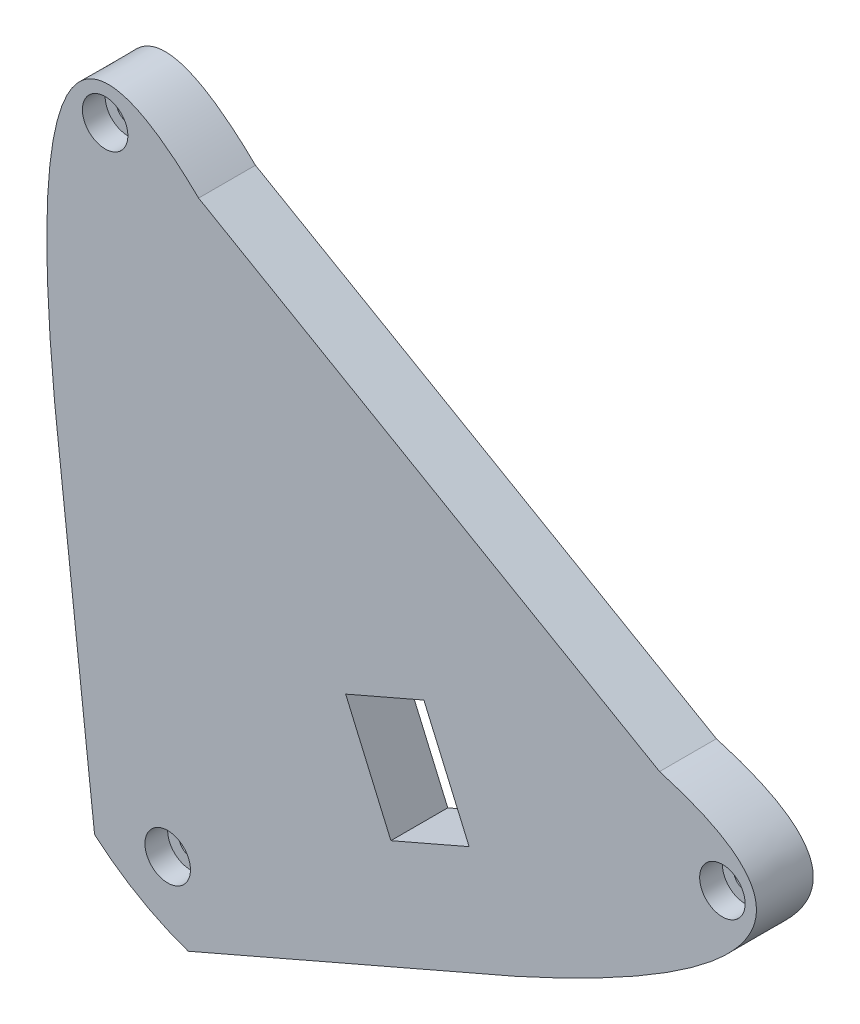
ISO-10303-21;
HEADER;
FILE_DESCRIPTION(('STEP AP214'),'2;1');
FILE_NAME('part.step','',(''),(''),'','','');
FILE_SCHEMA(('AUTOMOTIVE_DESIGN { 1 0 10303 214 1 1 1 1 }'));
ENDSEC;
DATA;
#1=APPLICATION_CONTEXT('core data for automotive mechanical design processes');
#2=APPLICATION_PROTOCOL_DEFINITION('international standard','automotive_design',2000,#1);
#3=PRODUCT_CONTEXT('',#1,'mechanical');
#4=PRODUCT('Part','Part','',(#3));
#5=PRODUCT_RELATED_PRODUCT_CATEGORY('part','',(#4));
#6=PRODUCT_DEFINITION_FORMATION('','',#4);
#7=PRODUCT_DEFINITION_CONTEXT('part definition',#1,'design');
#8=PRODUCT_DEFINITION('design','',#6,#7);
#9=PRODUCT_DEFINITION_SHAPE('','',#8);
#10=(LENGTH_UNIT() NAMED_UNIT(*) SI_UNIT(.MILLI.,.METRE.));
#11=(NAMED_UNIT(*) PLANE_ANGLE_UNIT() SI_UNIT($,.RADIAN.));
#12=(NAMED_UNIT(*) SI_UNIT($,.STERADIAN.) SOLID_ANGLE_UNIT());
#13=UNCERTAINTY_MEASURE_WITH_UNIT(LENGTH_MEASURE(1.E-05),#10,'distance_accuracy_value','');
#14=(GEOMETRIC_REPRESENTATION_CONTEXT(3) GLOBAL_UNCERTAINTY_ASSIGNED_CONTEXT((#13)) GLOBAL_UNIT_ASSIGNED_CONTEXT((#10,
#11,#12)) REPRESENTATION_CONTEXT('',''));
#15=CARTESIAN_POINT('',(0.,0.,0.));
#16=DIRECTION('',(0.,0.,1.));
#17=DIRECTION('',(1.,0.,0.));
#18=AXIS2_PLACEMENT_3D('',#15,#16,#17);
#19=CARTESIAN_POINT('',(-19.9999999999671,-34.6410161513855,-10.000025));
#20=DIRECTION('',(0.,0.,1.));
#21=DIRECTION('',(1.,0.,0.));
#22=AXIS2_PLACEMENT_3D('',#19,#20,#21);
#23=CYLINDRICAL_SURFACE('',#22,1.99999999999974);
#24=CARTESIAN_POINT('',(-19.9999999999671,-34.6410161513855,-10.));
#25=DIRECTION('',(0.,0.,1.));
#26=DIRECTION('',(1.,0.,0.));
#27=AXIS2_PLACEMENT_3D('',#24,#25,#26);
#28=CIRCLE('',#27,1.99999999999974);
#29=CARTESIAN_POINT('',(-17.9999999999674,-34.6410161513855,-10.));
#30=VERTEX_POINT('',#29);
#31=EDGE_CURVE('E360',#30,#30,#28,.T.);
#32=ORIENTED_EDGE('',*,*,#31,.F.);
#33=EDGE_LOOP('',(#32));
#34=FACE_BOUND('',#33,.T.);
#35=CARTESIAN_POINT('',(-19.9999999999671,-34.6410161513855,-4.));
#36=DIRECTION('',(0.,0.,1.));
#37=DIRECTION('',(1.,0.,0.));
#38=AXIS2_PLACEMENT_3D('',#35,#36,#37);
#39=CIRCLE('',#38,1.99999999999974);
#40=CARTESIAN_POINT('',(-17.9999999999674,-34.6410161513855,-4.));
#41=VERTEX_POINT('',#40);
#42=EDGE_CURVE('E43',#41,#41,#39,.F.);
#43=ORIENTED_EDGE('',*,*,#42,.F.);
#44=EDGE_LOOP('',(#43));
#45=FACE_BOUND('',#44,.T.);
#46=ADVANCED_FACE('F39',(#34,#45),#23,.F.);
#47=CARTESIAN_POINT('',(-31.0025184223115,71.6681652679213,10.));
#48=DIRECTION('',(0.,0.,-1.));
#49=DIRECTION('',(-1.,0.,0.));
#50=AXIS2_PLACEMENT_3D('',#47,#48,#49);
#51=CYLINDRICAL_SURFACE('',#50,1.99999999999708);
#52=CARTESIAN_POINT('',(-31.0025184223115,71.6681652679213,-10.));
#53=DIRECTION('',(0.,0.,1.));
#54=DIRECTION('',(1.,0.,0.));
#55=AXIS2_PLACEMENT_3D('',#52,#53,#54);
#56=CIRCLE('',#55,1.99999999999706);
#57=CARTESIAN_POINT('',(-29.0025184223144,71.6681652679213,-10.));
#58=VERTEX_POINT('',#57);
#59=EDGE_CURVE('E350',#58,#58,#56,.T.);
#60=ORIENTED_EDGE('',*,*,#59,.F.);
#61=EDGE_LOOP('',(#60));
#62=FACE_BOUND('',#61,.T.);
#63=CARTESIAN_POINT('',(-31.0025184223115,71.6681652679213,-4.));
#64=DIRECTION('',(0.,0.,1.));
#65=DIRECTION('',(1.,0.,0.));
#66=AXIS2_PLACEMENT_3D('',#63,#64,#65);
#67=CIRCLE('',#66,1.99999999999708);
#68=CARTESIAN_POINT('',(-29.0025184223144,71.6681652679213,-4.));
#69=VERTEX_POINT('',#68);
#70=EDGE_CURVE('E163',#69,#69,#67,.F.);
#71=ORIENTED_EDGE('',*,*,#70,.F.);
#72=EDGE_LOOP('',(#71));
#73=FACE_BOUND('',#72,.T.);
#74=ADVANCED_FACE('F258',(#62,#73),#51,.F.);
#75=CARTESIAN_POINT('',(77.5685544225147,8.98307716251005,10.));
#76=DIRECTION('',(0.,0.,-1.));
#77=DIRECTION('',(-1.,0.,0.));
#78=AXIS2_PLACEMENT_3D('',#75,#76,#77);
#79=CYLINDRICAL_SURFACE('',#78,1.99999999997602);
#80=CARTESIAN_POINT('',(77.5685544225147,8.98307716251005,-10.));
#81=DIRECTION('',(0.,0.,1.));
#82=DIRECTION('',(1.,0.,0.));
#83=AXIS2_PLACEMENT_3D('',#80,#81,#82);
#84=CIRCLE('',#83,1.9999999999738);
#85=CARTESIAN_POINT('',(79.5685544224885,8.98307716251005,-10.));
#86=VERTEX_POINT('',#85);
#87=EDGE_CURVE('E236',#86,#86,#84,.T.);
#88=ORIENTED_EDGE('',*,*,#87,.F.);
#89=EDGE_LOOP('',(#88));
#90=FACE_BOUND('',#89,.T.);
#91=CARTESIAN_POINT('',(77.5685544225147,8.98307716251005,-4.));
#92=DIRECTION('',(0.,0.,1.));
#93=DIRECTION('',(1.,0.,0.));
#94=AXIS2_PLACEMENT_3D('',#91,#92,#93);
#95=CIRCLE('',#94,1.99999999997602);
#96=CARTESIAN_POINT('',(79.5685544224907,8.98307716251005,-4.));
#97=VERTEX_POINT('',#96);
#98=EDGE_CURVE('E170',#97,#97,#95,.F.);
#99=ORIENTED_EDGE('',*,*,#98,.F.);
#100=EDGE_LOOP('',(#99));
#101=FACE_BOUND('',#100,.T.);
#102=ADVANCED_FACE('F260',(#90,#101),#79,.F.);
#103=CARTESIAN_POINT('',(-32.8605571852556,-37.6853258109114,-10.));
#104=DIRECTION('',(0.993699989141695,0.112072885123007,0.));
#105=DIRECTION('',(-0.112072885123007,0.993699989141695,0.));
#106=AXIS2_PLACEMENT_3D('',#103,#104,#105);
#107=PLANE('',#106);
#108=DIRECTION('',(-0.112072885123007,0.993699989141695,0.));
#109=VECTOR('',#108,1.);
#110=CARTESIAN_POINT('',(-32.8605571852556,-37.6853258109114,0.));
#111=LINE('',#110,#109);
#112=CARTESIAN_POINT('',(-32.8605571852556,-37.6853258109114,0.));
#113=VERTEX_POINT('',#112);
#114=CARTESIAN_POINT('',(-39.8797413229761,24.5506306720594,0.));
#115=VERTEX_POINT('',#114);
#116=EDGE_CURVE('E313',#113,#115,#111,.T.);
#117=ORIENTED_EDGE('',*,*,#116,.T.);
#118=DIRECTION('',(0.,0.,1.));
#119=VECTOR('',#118,1.);
#120=CARTESIAN_POINT('',(-39.8797413229761,24.5506306720594,-10.));
#121=LINE('',#120,#119);
#122=CARTESIAN_POINT('',(-39.8797413229761,24.5506306720594,-10.));
#123=VERTEX_POINT('',#122);
#124=EDGE_CURVE('E317',#123,#115,#121,.T.);
#125=ORIENTED_EDGE('',*,*,#124,.F.);
#126=DIRECTION('',(-0.112072885123007,0.993699989141695,0.));
#127=VECTOR('',#126,1.);
#128=CARTESIAN_POINT('',(-32.8605571852556,-37.6853258109114,-10.));
#129=LINE('',#128,#127);
#130=CARTESIAN_POINT('',(-32.8605571852556,-37.6853258109114,-10.));
#131=VERTEX_POINT('',#130);
#132=EDGE_CURVE('E304',#131,#123,#129,.T.);
#133=ORIENTED_EDGE('',*,*,#132,.F.);
#134=DIRECTION('',(0.,0.,1.));
#135=VECTOR('',#134,1.);
#136=CARTESIAN_POINT('',(-32.8605571852556,-37.6853258109114,-10.));
#137=LINE('',#136,#135);
#138=EDGE_CURVE('E320',#131,#113,#137,.T.);
#139=ORIENTED_EDGE('',*,*,#138,.T.);
#140=EDGE_LOOP('',(#117,#125,#133,#139));
#141=FACE_BOUND('',#140,.T.);
#142=ADVANCED_FACE('F263',(#141),#107,.F.);
#143=CARTESIAN_POINT('',(66.5193094190735,21.5904547621005,-10.));
#144=DIRECTION('',(-0.500008271954438,-0.866020627916643,0.));
#145=DIRECTION('',(0.866020627916643,-0.500008271954438,0.));
#146=AXIS2_PLACEMENT_3D('',#143,#144,#145);
#147=PLANE('',#146);
#148=DIRECTION('',(0.866020627916643,-0.500008271954438,0.));
#149=VECTOR('',#148,1.);
#150=CARTESIAN_POINT('',(66.5193094190735,21.5904547621005,0.));
#151=LINE('',#150,#149);
#152=CARTESIAN_POINT('',(-14.5613252713761,68.4034136382289,0.));
#153=VERTEX_POINT('',#152);
#154=CARTESIAN_POINT('',(66.5193094190686,21.590454762098,0.));
#155=VERTEX_POINT('',#154);
#156=EDGE_CURVE('E244',#153,#155,#151,.T.);
#157=ORIENTED_EDGE('',*,*,#156,.T.);
#158=DIRECTION('',(0.,0.,1.));
#159=VECTOR('',#158,1.);
#160=CARTESIAN_POINT('',(66.5193094190735,21.5904547621005,-10.));
#161=LINE('',#160,#159);
#162=CARTESIAN_POINT('',(66.5193094190735,21.5904547621005,-10.));
#163=VERTEX_POINT('',#162);
#164=EDGE_CURVE('E309',#163,#155,#161,.T.);
#165=ORIENTED_EDGE('',*,*,#164,.F.);
#166=DIRECTION('',(0.866020627916643,-0.500008271954438,0.));
#167=VECTOR('',#166,1.);
#168=CARTESIAN_POINT('',(66.5193094190735,21.5904547621005,-10.));
#169=LINE('',#168,#167);
#170=CARTESIAN_POINT('',(-14.5613252715264,68.4034136379685,-10.));
#171=VERTEX_POINT('',#170);
#172=EDGE_CURVE('E303',#171,#163,#169,.T.);
#173=ORIENTED_EDGE('',*,*,#172,.F.);
#174=DIRECTION('',(0.,0.,1.));
#175=VECTOR('',#174,1.);
#176=CARTESIAN_POINT('',(-14.5613252715264,68.4034136379685,-10.));
#177=LINE('',#176,#175);
#178=EDGE_CURVE('E321',#171,#153,#177,.T.);
#179=ORIENTED_EDGE('',*,*,#178,.T.);
#180=EDGE_LOOP('',(#157,#165,#173,#179));
#181=FACE_BOUND('',#180,.T.);
#182=ADVANCED_FACE('F269',(#181),#147,.F.);
#183=CARTESIAN_POINT('',(347781.240949664,-937493.25120147,-10.));
#184=CARTESIAN_POINT('',(-351266.927481728,936365.067628403,-10.));
#185=CARTESIAN_POINT('',(354620.84295731,-934927.479350772,-10.));
#186=B_SPLINE_CURVE_WITH_KNOTS('',2,(#183,#184,#185),.UNSPECIFIED.,.F.,.F.,(3,3),(0.,1.),.UNSPECIFIED.);
#187=DIRECTION('',(0.,0.,1.));
#188=VECTOR('',#187,1.);
#189=SURFACE_OF_LINEAR_EXTRUSION('',#186,#188);
#190=CARTESIAN_POINT('',(-39.8797413229761,24.5506306720594,0.));
#191=CARTESIAN_POINT('',(-49.4507614021182,121.356698814482,0.));
#192=CARTESIAN_POINT('',(7.01020764564998,42.1406762638789,0.));
#193=B_SPLINE_CURVE_WITH_KNOTS('',2,(#190,#191,#192),.UNSPECIFIED.,.F.,.F.,(3,3),(0.,1.),.UNSPECIFIED.);
#194=EDGE_CURVE('E11',#115,#153,#193,.T.);
#195=ORIENTED_EDGE('',*,*,#194,.T.);
#196=ORIENTED_EDGE('',*,*,#178,.F.);
#197=EDGE_CURVE('E297',#123,#171,#186,.T.);
#198=ORIENTED_EDGE('',*,*,#197,.F.);
#199=ORIENTED_EDGE('',*,*,#124,.T.);
#200=EDGE_LOOP('',(#195,#196,#198,#199));
#201=FACE_BOUND('',#200,.T.);
#202=ADVANCED_FACE('F287',(#201),#189,.F.);
#203=CARTESIAN_POINT('',(83.4602158814448,10.145005483821,-10.));
#204=DIRECTION('',(0.,0.,1.));
#205=DIRECTION('',(1.,0.,0.));
#206=AXIS2_PLACEMENT_3D('',#203,#204,#205);
#207=PLANE('',#206);
#208=DIRECTION('',(0.397857064454927,-0.917447413350383,0.));
#209=VECTOR('',#208,1.);
#210=CARTESIAN_POINT('',(25.0659782440868,11.7511390990852,-10.));
#211=LINE('',#210,#209);
#212=CARTESIAN_POINT('',(25.0659782440868,11.7511390990852,-10.));
#213=VERTEX_POINT('',#212);
#214=CARTESIAN_POINT('',(33.0231195331853,-6.59780916792243,-10.));
#215=VERTEX_POINT('',#214);
#216=EDGE_CURVE('E141',#213,#215,#211,.T.);
#217=ORIENTED_EDGE('',*,*,#216,.F.);
#218=DIRECTION('',(0.917447413350383,0.397857064454927,0.));
#219=VECTOR('',#218,1.);
#220=CARTESIAN_POINT('',(11.3042670438311,5.78328313226132,-10.));
#221=LINE('',#220,#219);
#222=CARTESIAN_POINT('',(11.3042670438311,5.78328313226132,-10.));
#223=VERTEX_POINT('',#222);
#224=EDGE_CURVE('E134',#223,#213,#221,.T.);
#225=ORIENTED_EDGE('',*,*,#224,.F.);
#226=DIRECTION('',(-0.397857064454927,0.917447413350383,0.));
#227=VECTOR('',#226,1.);
#228=CARTESIAN_POINT('',(11.3042670438311,5.78328313226132,-10.));
#229=LINE('',#228,#227);
#230=CARTESIAN_POINT('',(19.2614083329296,-12.5656651347463,-10.));
#231=VERTEX_POINT('',#230);
#232=EDGE_CURVE('E145',#231,#223,#229,.T.);
#233=ORIENTED_EDGE('',*,*,#232,.F.);
#234=DIRECTION('',(-0.917447413350382,-0.397857064454927,0.));
#235=VECTOR('',#234,1.);
#236=CARTESIAN_POINT('',(19.2614083329296,-12.5656651347463,-10.));
#237=LINE('',#236,#235);
#238=EDGE_CURVE('E56',#215,#231,#237,.T.);
#239=ORIENTED_EDGE('',*,*,#238,.F.);
#240=EDGE_LOOP('',(#217,#225,#233,#239));
#241=FACE_BOUND('',#240,.T.);
#242=CARTESIAN_POINT('',(15.8487739846796,11.5689708061704,-10.));
#243=DIRECTION('',(0.,0.,-1.));
#244=DIRECTION('',(-1.,0.,0.));
#245=AXIS2_PLACEMENT_3D('',#242,#243,#244);
#246=CIRCLE('',#245,1.25);
#247=CARTESIAN_POINT('',(14.5987739846796,11.5689708061704,-10.));
#248=VERTEX_POINT('',#247);
#249=EDGE_CURVE('E178',#248,#248,#246,.T.);
#250=ORIENTED_EDGE('',*,*,#249,.F.);
#251=EDGE_LOOP('',(#250));
#252=FACE_BOUND('',#251,.T.);
#253=CARTESIAN_POINT('',(23.1883532914827,14.7518273218098,-10.));
#254=DIRECTION('',(0.,0.,-1.));
#255=DIRECTION('',(-1.,0.,0.));
#256=AXIS2_PLACEMENT_3D('',#253,#254,#255);
#257=CIRCLE('',#256,1.25);
#258=CARTESIAN_POINT('',(21.9383532914827,14.7518273218098,-10.));
#259=VERTEX_POINT('',#258);
#260=EDGE_CURVE('E177',#259,#259,#257,.T.);
#261=ORIENTED_EDGE('',*,*,#260,.F.);
#262=EDGE_LOOP('',(#261));
#263=FACE_BOUND('',#262,.T.);
#264=CARTESIAN_POINT('',(30.5279325982857,17.9346838374492,-10.));
#265=DIRECTION('',(0.,0.,-1.));
#266=DIRECTION('',(-1.,0.,0.));
#267=AXIS2_PLACEMENT_3D('',#264,#265,#266);
#268=CIRCLE('',#267,1.25000000000001);
#269=CARTESIAN_POINT('',(29.2779325982857,17.9346838374492,-10.));
#270=VERTEX_POINT('',#269);
#271=EDGE_CURVE('E184',#270,#270,#268,.T.);
#272=ORIENTED_EDGE('',*,*,#271,.F.);
#273=EDGE_LOOP('',(#272));
#274=FACE_BOUND('',#273,.T.);
#275=CARTESIAN_POINT('',(37.5327453728774,14.9774726524105,-10.));
#276=DIRECTION('',(0.,0.,-1.));
#277=DIRECTION('',(-1.,0.,0.));
#278=AXIS2_PLACEMENT_3D('',#275,#276,#277);
#279=CIRCLE('',#278,1.25);
#280=CARTESIAN_POINT('',(36.2827453728774,14.9774726524105,-10.));
#281=VERTEX_POINT('',#280);
#282=EDGE_CURVE('E190',#281,#281,#279,.T.);
#283=ORIENTED_EDGE('',*,*,#282,.F.);
#284=EDGE_LOOP('',(#283));
#285=FACE_BOUND('',#284,.T.);
#286=CARTESIAN_POINT('',(43.8984584041562,0.298314038804333,-10.));
#287=DIRECTION('',(0.,0.,-1.));
#288=DIRECTION('',(-1.,0.,0.));
#289=AXIS2_PLACEMENT_3D('',#286,#287,#288);
#290=CIRCLE('',#289,1.25);
#291=CARTESIAN_POINT('',(42.6484584041562,0.298314038804333,-10.));
#292=VERTEX_POINT('',#291);
#293=EDGE_CURVE('E196',#292,#292,#290,.T.);
#294=ORIENTED_EDGE('',*,*,#293,.F.);
#295=EDGE_LOOP('',(#294));
#296=FACE_BOUND('',#295,.T.);
#297=CARTESIAN_POINT('',(41.2700733385688,-6.83639632301115,-10.));
#298=DIRECTION('',(0.,0.,-1.));
#299=DIRECTION('',(-1.,0.,0.));
#300=AXIS2_PLACEMENT_3D('',#297,#298,#299);
#301=CIRCLE('',#300,1.25);
#302=CARTESIAN_POINT('',(40.0200733385688,-6.83639632301115,-10.));
#303=VERTEX_POINT('',#302);
#304=EDGE_CURVE('E202',#303,#303,#301,.T.);
#305=ORIENTED_EDGE('',*,*,#304,.F.);
#306=EDGE_LOOP('',(#305));
#307=FACE_BOUND('',#306,.T.);
#308=CARTESIAN_POINT('',(33.9304940317657,-10.0192528386506,-10.));
#309=DIRECTION('',(0.,0.,-1.));
#310=DIRECTION('',(-1.,0.,0.));
#311=AXIS2_PLACEMENT_3D('',#308,#309,#310);
#312=CIRCLE('',#311,1.25);
#313=CARTESIAN_POINT('',(32.6804940317657,-10.0192528386506,-10.));
#314=VERTEX_POINT('',#313);
#315=EDGE_CURVE('E208',#314,#314,#312,.T.);
#316=ORIENTED_EDGE('',*,*,#315,.F.);
#317=EDGE_LOOP('',(#316));
#318=FACE_BOUND('',#317,.T.);
#319=CARTESIAN_POINT('',(26.5909147249626,-13.20210935429,-10.));
#320=DIRECTION('',(0.,0.,-1.));
#321=DIRECTION('',(-1.,0.,0.));
#322=AXIS2_PLACEMENT_3D('',#319,#320,#321);
#323=CIRCLE('',#322,1.25);
#324=CARTESIAN_POINT('',(25.3409147249626,-13.20210935429,-10.));
#325=VERTEX_POINT('',#324);
#326=EDGE_CURVE('E214',#325,#325,#323,.T.);
#327=ORIENTED_EDGE('',*,*,#326,.F.);
#328=EDGE_LOOP('',(#327));
#329=FACE_BOUND('',#328,.T.);
#330=CARTESIAN_POINT('',(19.2513354181596,-16.3849658699294,-10.));
#331=DIRECTION('',(0.,0.,-1.));
#332=DIRECTION('',(-1.,0.,0.));
#333=AXIS2_PLACEMENT_3D('',#330,#331,#332);
#334=CIRCLE('',#333,1.25);
#335=CARTESIAN_POINT('',(18.0013354181596,-16.3849658699294,-10.));
#336=VERTEX_POINT('',#335);
#337=EDGE_CURVE('E220',#336,#336,#334,.T.);
#338=ORIENTED_EDGE('',*,*,#337,.F.);
#339=EDGE_LOOP('',(#338));
#340=FACE_BOUND('',#339,.T.);
#341=CARTESIAN_POINT('',(8.50919467787656,8.38611429053095,-10.));
#342=DIRECTION('',(0.,0.,-1.));
#343=DIRECTION('',(-1.,0.,0.));
#344=AXIS2_PLACEMENT_3D('',#341,#342,#343);
#345=CIRCLE('',#344,1.25);
#346=CARTESIAN_POINT('',(7.25919467787656,8.38611429053095,-10.));
#347=VERTEX_POINT('',#346);
#348=EDGE_CURVE('E226',#347,#347,#345,.T.);
#349=ORIENTED_EDGE('',*,*,#348,.F.);
#350=EDGE_LOOP('',(#349));
#351=FACE_BOUND('',#350,.T.);
#352=ORIENTED_EDGE('',*,*,#87,.T.);
#353=EDGE_LOOP('',(#352));
#354=FACE_BOUND('',#353,.T.);
#355=ORIENTED_EDGE('',*,*,#31,.T.);
#356=EDGE_LOOP('',(#355));
#357=FACE_BOUND('',#356,.T.);
#358=ORIENTED_EDGE('',*,*,#59,.T.);
#359=EDGE_LOOP('',(#358));
#360=FACE_BOUND('',#359,.T.);
#361=CARTESIAN_POINT('',(-986984.720288562,-160332.448870074,-10.));
#362=CARTESIAN_POINT('',(986552.837890996,163955.766811227,-10.));
#363=CARTESIAN_POINT('',(-985787.114629905,-167538.504730445,-10.));
#364=B_SPLINE_CURVE_WITH_KNOTS('',2,(#361,#362,#363),.UNSPECIFIED.,.F.,.F.,(3,3),(0.,1.),.UNSPECIFIED.);
#365=CARTESIAN_POINT('',(41.2013405024208,-22.2615537460207,-10.));
#366=VERTEX_POINT('',#365);
#367=EDGE_CURVE('E237',#163,#366,#364,.T.);
#368=ORIENTED_EDGE('',*,*,#367,.T.);
#369=DIRECTION('',(-0.917447413350383,-0.397857064454926,0.));
#370=VECTOR('',#369,1.);
#371=CARTESIAN_POINT('',(41.2013405024208,-22.2615537460207,-10.));
#372=LINE('',#371,#370);
#373=CARTESIAN_POINT('',(-16.3912070082697,-47.2369382243605,-10.));
#374=VERTEX_POINT('',#373);
#375=EDGE_CURVE('E243',#366,#374,#372,.T.);
#376=ORIENTED_EDGE('',*,*,#375,.T.);
#377=CARTESIAN_POINT('',(0.,0.,-10.));
#378=DIRECTION('',(0.,0.,-1.));
#379=DIRECTION('',(-1.,0.,0.));
#380=AXIS2_PLACEMENT_3D('',#377,#378,#379);
#381=CIRCLE('',#380,50.);
#382=EDGE_CURVE('E487',#374,#131,#381,.T.);
#383=ORIENTED_EDGE('',*,*,#382,.T.);
#384=ORIENTED_EDGE('',*,*,#132,.T.);
#385=ORIENTED_EDGE('',*,*,#197,.T.);
#386=ORIENTED_EDGE('',*,*,#172,.T.);
#387=EDGE_LOOP('',(#368,#376,#383,#384,#385,#386));
#388=FACE_BOUND('',#387,.T.);
#389=ADVANCED_FACE('F284',(#241,#252,#263,#274,#285,#296,#307,#318,#329,#340,#351,#354,#357,
#360,#388),#207,.F.);
#390=CARTESIAN_POINT('',(0.,0.,10.));
#391=DIRECTION('',(0.,0.,-1.));
#392=DIRECTION('',(-1.,0.,0.));
#393=AXIS2_PLACEMENT_3D('',#390,#391,#392);
#394=CYLINDRICAL_SURFACE('',#393,50.);
#395=CARTESIAN_POINT('',(0.,0.,0.));
#396=DIRECTION('',(0.,0.,1.));
#397=DIRECTION('',(1.,0.,0.));
#398=AXIS2_PLACEMENT_3D('',#395,#396,#397);
#399=CIRCLE('',#398,50.);
#400=CARTESIAN_POINT('',(-16.3912070082697,-47.2369382243605,0.));
#401=VERTEX_POINT('',#400);
#402=EDGE_CURVE('E232',#113,#401,#399,.T.);
#403=ORIENTED_EDGE('',*,*,#402,.F.);
#404=ORIENTED_EDGE('',*,*,#138,.F.);
#405=ORIENTED_EDGE('',*,*,#382,.F.);
#406=DIRECTION('',(0.,0.,1.));
#407=VECTOR('',#406,1.);
#408=CARTESIAN_POINT('',(-16.3912070082697,-47.2369382243605,-10.));
#409=LINE('',#408,#407);
#410=EDGE_CURVE('E324',#374,#401,#409,.T.);
#411=ORIENTED_EDGE('',*,*,#410,.T.);
#412=EDGE_LOOP('',(#403,#404,#405,#411));
#413=FACE_BOUND('',#412,.T.);
#414=ADVANCED_FACE('F41',(#413),#394,.T.);
#415=CARTESIAN_POINT('',(83.4602158814448,10.145005483821,0.));
#416=DIRECTION('',(0.,0.,1.));
#417=DIRECTION('',(1.,0.,0.));
#418=AXIS2_PLACEMENT_3D('',#415,#416,#417);
#419=PLANE('',#418);
#420=DIRECTION('',(0.917447413350383,0.397857064454927,0.));
#421=VECTOR('',#420,1.);
#422=CARTESIAN_POINT('',(11.3042670438311,5.78328313226132,0.));
#423=LINE('',#422,#421);
#424=CARTESIAN_POINT('',(11.3042670438311,5.78328313226132,0.));
#425=VERTEX_POINT('',#424);
#426=CARTESIAN_POINT('',(25.0659782440868,11.7511390990852,0.));
#427=VERTEX_POINT('',#426);
#428=EDGE_CURVE('E131',#425,#427,#423,.T.);
#429=ORIENTED_EDGE('',*,*,#428,.T.);
#430=DIRECTION('',(0.397857064454927,-0.917447413350383,0.));
#431=VECTOR('',#430,1.);
#432=CARTESIAN_POINT('',(25.0659782440868,11.7511390990852,0.));
#433=LINE('',#432,#431);
#434=CARTESIAN_POINT('',(33.0231195331853,-6.59780916792243,0.));
#435=VERTEX_POINT('',#434);
#436=EDGE_CURVE('E118',#427,#435,#433,.T.);
#437=ORIENTED_EDGE('',*,*,#436,.T.);
#438=DIRECTION('',(-0.917447413350383,-0.397857064454927,0.));
#439=VECTOR('',#438,1.);
#440=CARTESIAN_POINT('',(19.2614083329296,-12.5656651347463,0.));
#441=LINE('',#440,#439);
#442=CARTESIAN_POINT('',(19.2614083329296,-12.5656651347463,0.));
#443=VERTEX_POINT('',#442);
#444=EDGE_CURVE('E149',#435,#443,#441,.T.);
#445=ORIENTED_EDGE('',*,*,#444,.T.);
#446=DIRECTION('',(-0.397857064454927,0.917447413350383,0.));
#447=VECTOR('',#446,1.);
#448=CARTESIAN_POINT('',(11.3042670438311,5.78328313226132,0.));
#449=LINE('',#448,#447);
#450=EDGE_CURVE('E139',#443,#425,#449,.T.);
#451=ORIENTED_EDGE('',*,*,#450,.T.);
#452=EDGE_LOOP('',(#429,#437,#445,#451));
#453=FACE_BOUND('',#452,.T.);
#454=CARTESIAN_POINT('',(-19.9999999999671,-34.6410161513855,0.));
#455=DIRECTION('',(0.,0.,1.));
#456=DIRECTION('',(1.,0.,0.));
#457=AXIS2_PLACEMENT_3D('',#454,#455,#456);
#458=CIRCLE('',#457,4.);
#459=CARTESIAN_POINT('',(-15.9999999999671,-34.6410161513855,0.));
#460=VERTEX_POINT('',#459);
#461=EDGE_CURVE('E154',#460,#460,#458,.T.);
#462=ORIENTED_EDGE('',*,*,#461,.F.);
#463=EDGE_LOOP('',(#462));
#464=FACE_BOUND('',#463,.T.);
#465=CARTESIAN_POINT('',(-31.0025184223115,71.6681652679213,0.));
#466=DIRECTION('',(0.,0.,1.));
#467=DIRECTION('',(1.,0.,0.));
#468=AXIS2_PLACEMENT_3D('',#465,#466,#467);
#469=CIRCLE('',#468,4.);
#470=CARTESIAN_POINT('',(-27.0025184223115,71.6681652679213,0.));
#471=VERTEX_POINT('',#470);
#472=EDGE_CURVE('E164',#471,#471,#469,.T.);
#473=ORIENTED_EDGE('',*,*,#472,.F.);
#474=EDGE_LOOP('',(#473));
#475=FACE_BOUND('',#474,.T.);
#476=CARTESIAN_POINT('',(77.5685544225147,8.98307716251005,0.));
#477=DIRECTION('',(0.,0.,1.));
#478=DIRECTION('',(1.,0.,0.));
#479=AXIS2_PLACEMENT_3D('',#476,#477,#478);
#480=CIRCLE('',#479,4.00000000000001);
#481=CARTESIAN_POINT('',(81.5685544225147,8.98307716251005,0.));
#482=VERTEX_POINT('',#481);
#483=EDGE_CURVE('E171',#482,#482,#480,.T.);
#484=ORIENTED_EDGE('',*,*,#483,.F.);
#485=EDGE_LOOP('',(#484));
#486=FACE_BOUND('',#485,.T.);
#487=ORIENTED_EDGE('',*,*,#116,.F.);
#488=ORIENTED_EDGE('',*,*,#402,.T.);
#489=DIRECTION('',(-0.917447413350383,-0.397857064454926,0.));
#490=VECTOR('',#489,1.);
#491=CARTESIAN_POINT('',(41.2013405024208,-22.2615537460207,0.));
#492=LINE('',#491,#490);
#493=CARTESIAN_POINT('',(41.2013405024208,-22.2615537460207,0.));
#494=VERTEX_POINT('',#493);
#495=EDGE_CURVE('E310',#494,#401,#492,.T.);
#496=ORIENTED_EDGE('',*,*,#495,.F.);
#497=CARTESIAN_POINT('',(-986984.720288562,-160332.448870074,0.));
#498=CARTESIAN_POINT('',(986552.837890996,163955.766811227,0.));
#499=CARTESIAN_POINT('',(-985787.114629905,-167538.504730445,0.));
#500=B_SPLINE_CURVE_WITH_KNOTS('',2,(#497,#498,#499),.UNSPECIFIED.,.F.,.F.,(3,3),(0.,1.),.UNSPECIFIED.);
#501=EDGE_CURVE('E314',#155,#494,#500,.T.);
#502=ORIENTED_EDGE('',*,*,#501,.F.);
#503=ORIENTED_EDGE('',*,*,#156,.F.);
#504=ORIENTED_EDGE('',*,*,#194,.F.);
#505=EDGE_LOOP('',(#487,#488,#496,#502,#503,#504));
#506=FACE_BOUND('',#505,.T.);
#507=ADVANCED_FACE('F137',(#453,#464,#475,#486,#506),#419,.T.);
#508=CARTESIAN_POINT('',(41.2013405024208,-22.2615537460207,-10.));
#509=DIRECTION('',(-0.397857064454926,0.917447413350383,0.));
#510=DIRECTION('',(-0.917447413350383,-0.397857064454927,0.));
#511=AXIS2_PLACEMENT_3D('',#508,#509,#510);
#512=PLANE('',#511);
#513=ORIENTED_EDGE('',*,*,#495,.T.);
#514=ORIENTED_EDGE('',*,*,#410,.F.);
#515=ORIENTED_EDGE('',*,*,#375,.F.);
#516=DIRECTION('',(0.,0.,1.));
#517=VECTOR('',#516,1.);
#518=CARTESIAN_POINT('',(41.2013405024208,-22.2615537460207,-10.));
#519=LINE('',#518,#517);
#520=EDGE_CURVE('E48',#366,#494,#519,.T.);
#521=ORIENTED_EDGE('',*,*,#520,.T.);
#522=EDGE_LOOP('',(#513,#514,#515,#521));
#523=FACE_BOUND('',#522,.T.);
#524=ADVANCED_FACE('F255',(#523),#512,.F.);
#525=DIRECTION('',(0.,0.,1.));
#526=VECTOR('',#525,1.);
#527=SURFACE_OF_LINEAR_EXTRUSION('',#364,#526);
#528=ORIENTED_EDGE('',*,*,#501,.T.);
#529=ORIENTED_EDGE('',*,*,#520,.F.);
#530=ORIENTED_EDGE('',*,*,#367,.F.);
#531=ORIENTED_EDGE('',*,*,#164,.T.);
#532=EDGE_LOOP('',(#528,#529,#530,#531));
#533=FACE_BOUND('',#532,.T.);
#534=ADVANCED_FACE('F250',(#533),#527,.F.);
#535=CARTESIAN_POINT('',(8.50919467787656,8.38611429053095,-6.));
#536=DIRECTION('',(0.,0.,-1.));
#537=DIRECTION('',(-1.,0.,0.));
#538=AXIS2_PLACEMENT_3D('',#535,#536,#537);
#539=CYLINDRICAL_SURFACE('',#538,1.25);
#540=CARTESIAN_POINT('',(8.50919467787656,8.38611429053095,-6.));
#541=DIRECTION('',(0.,0.,-1.));
#542=DIRECTION('',(-1.,0.,0.));
#543=AXIS2_PLACEMENT_3D('',#540,#541,#542);
#544=CIRCLE('',#543,1.25);
#545=CARTESIAN_POINT('',(7.25919467787656,8.38611429053095,-6.));
#546=VERTEX_POINT('',#545);
#547=EDGE_CURVE('E229',#546,#546,#544,.T.);
#548=ORIENTED_EDGE('',*,*,#547,.F.);
#549=EDGE_LOOP('',(#548));
#550=FACE_BOUND('',#549,.T.);
#551=ORIENTED_EDGE('',*,*,#348,.T.);
#552=EDGE_LOOP('',(#551));
#553=FACE_BOUND('',#552,.T.);
#554=ADVANCED_FACE('F254',(#550,#553),#539,.F.);
#555=CARTESIAN_POINT('',(8.50919467787656,8.38611429053095,-6.));
#556=DIRECTION('',(0.,0.,-1.));
#557=DIRECTION('',(-1.,0.,0.));
#558=AXIS2_PLACEMENT_3D('',#555,#556,#557);
#559=PLANE('',#558);
#560=ORIENTED_EDGE('',*,*,#547,.T.);
#561=EDGE_LOOP('',(#560));
#562=FACE_BOUND('',#561,.T.);
#563=ADVANCED_FACE('F463',(#562),#559,.T.);
#564=CARTESIAN_POINT('',(19.2513354181596,-16.3849658699294,-6.));
#565=DIRECTION('',(0.,0.,-1.));
#566=DIRECTION('',(-1.,0.,0.));
#567=AXIS2_PLACEMENT_3D('',#564,#565,#566);
#568=CYLINDRICAL_SURFACE('',#567,1.25);
#569=CARTESIAN_POINT('',(19.2513354181596,-16.3849658699294,-6.));
#570=DIRECTION('',(0.,0.,-1.));
#571=DIRECTION('',(-1.,0.,0.));
#572=AXIS2_PLACEMENT_3D('',#569,#570,#571);
#573=CIRCLE('',#572,1.25);
#574=CARTESIAN_POINT('',(18.0013354181596,-16.3849658699294,-6.));
#575=VERTEX_POINT('',#574);
#576=EDGE_CURVE('E223',#575,#575,#573,.T.);
#577=ORIENTED_EDGE('',*,*,#576,.F.);
#578=EDGE_LOOP('',(#577));
#579=FACE_BOUND('',#578,.T.);
#580=ORIENTED_EDGE('',*,*,#337,.T.);
#581=EDGE_LOOP('',(#580));
#582=FACE_BOUND('',#581,.T.);
#583=ADVANCED_FACE('F460',(#579,#582),#568,.F.);
#584=CARTESIAN_POINT('',(19.2513354181596,-16.3849658699294,-6.));
#585=DIRECTION('',(0.,0.,-1.));
#586=DIRECTION('',(-1.,0.,0.));
#587=AXIS2_PLACEMENT_3D('',#584,#585,#586);
#588=PLANE('',#587);
#589=ORIENTED_EDGE('',*,*,#576,.T.);
#590=EDGE_LOOP('',(#589));
#591=FACE_BOUND('',#590,.T.);
#592=ADVANCED_FACE('F456',(#591),#588,.T.);
#593=CARTESIAN_POINT('',(26.5909147249626,-13.20210935429,-6.));
#594=DIRECTION('',(0.,0.,-1.));
#595=DIRECTION('',(-1.,0.,0.));
#596=AXIS2_PLACEMENT_3D('',#593,#594,#595);
#597=CYLINDRICAL_SURFACE('',#596,1.25);
#598=CARTESIAN_POINT('',(26.5909147249626,-13.20210935429,-6.));
#599=DIRECTION('',(0.,0.,-1.));
#600=DIRECTION('',(-1.,0.,0.));
#601=AXIS2_PLACEMENT_3D('',#598,#599,#600);
#602=CIRCLE('',#601,1.25);
#603=CARTESIAN_POINT('',(25.3409147249626,-13.20210935429,-6.));
#604=VERTEX_POINT('',#603);
#605=EDGE_CURVE('E217',#604,#604,#602,.T.);
#606=ORIENTED_EDGE('',*,*,#605,.F.);
#607=EDGE_LOOP('',(#606));
#608=FACE_BOUND('',#607,.T.);
#609=ORIENTED_EDGE('',*,*,#326,.T.);
#610=EDGE_LOOP('',(#609));
#611=FACE_BOUND('',#610,.T.);
#612=ADVANCED_FACE('F452',(#608,#611),#597,.F.);
#613=CARTESIAN_POINT('',(26.5909147249626,-13.20210935429,-6.));
#614=DIRECTION('',(0.,0.,-1.));
#615=DIRECTION('',(-1.,0.,0.));
#616=AXIS2_PLACEMENT_3D('',#613,#614,#615);
#617=PLANE('',#616);
#618=ORIENTED_EDGE('',*,*,#605,.T.);
#619=EDGE_LOOP('',(#618));
#620=FACE_BOUND('',#619,.T.);
#621=ADVANCED_FACE('F448',(#620),#617,.T.);
#622=CARTESIAN_POINT('',(33.9304940317657,-10.0192528386506,-6.));
#623=DIRECTION('',(0.,0.,-1.));
#624=DIRECTION('',(-1.,0.,0.));
#625=AXIS2_PLACEMENT_3D('',#622,#623,#624);
#626=CYLINDRICAL_SURFACE('',#625,1.25);
#627=CARTESIAN_POINT('',(33.9304940317657,-10.0192528386506,-6.));
#628=DIRECTION('',(0.,0.,-1.));
#629=DIRECTION('',(-1.,0.,0.));
#630=AXIS2_PLACEMENT_3D('',#627,#628,#629);
#631=CIRCLE('',#630,1.25);
#632=CARTESIAN_POINT('',(32.6804940317657,-10.0192528386506,-6.));
#633=VERTEX_POINT('',#632);
#634=EDGE_CURVE('E211',#633,#633,#631,.T.);
#635=ORIENTED_EDGE('',*,*,#634,.F.);
#636=EDGE_LOOP('',(#635));
#637=FACE_BOUND('',#636,.T.);
#638=ORIENTED_EDGE('',*,*,#315,.T.);
#639=EDGE_LOOP('',(#638));
#640=FACE_BOUND('',#639,.T.);
#641=ADVANCED_FACE('F444',(#637,#640),#626,.F.);
#642=CARTESIAN_POINT('',(33.9304940317657,-10.0192528386506,-6.));
#643=DIRECTION('',(0.,0.,-1.));
#644=DIRECTION('',(-1.,0.,0.));
#645=AXIS2_PLACEMENT_3D('',#642,#643,#644);
#646=PLANE('',#645);
#647=ORIENTED_EDGE('',*,*,#634,.T.);
#648=EDGE_LOOP('',(#647));
#649=FACE_BOUND('',#648,.T.);
#650=ADVANCED_FACE('F440',(#649),#646,.T.);
#651=CARTESIAN_POINT('',(41.2700733385688,-6.83639632301115,-6.));
#652=DIRECTION('',(0.,0.,-1.));
#653=DIRECTION('',(-1.,0.,0.));
#654=AXIS2_PLACEMENT_3D('',#651,#652,#653);
#655=CYLINDRICAL_SURFACE('',#654,1.25);
#656=CARTESIAN_POINT('',(41.2700733385688,-6.83639632301115,-6.));
#657=DIRECTION('',(0.,0.,-1.));
#658=DIRECTION('',(-1.,0.,0.));
#659=AXIS2_PLACEMENT_3D('',#656,#657,#658);
#660=CIRCLE('',#659,1.25);
#661=CARTESIAN_POINT('',(40.0200733385688,-6.83639632301115,-6.));
#662=VERTEX_POINT('',#661);
#663=EDGE_CURVE('E205',#662,#662,#660,.T.);
#664=ORIENTED_EDGE('',*,*,#663,.F.);
#665=EDGE_LOOP('',(#664));
#666=FACE_BOUND('',#665,.T.);
#667=ORIENTED_EDGE('',*,*,#304,.T.);
#668=EDGE_LOOP('',(#667));
#669=FACE_BOUND('',#668,.T.);
#670=ADVANCED_FACE('F436',(#666,#669),#655,.F.);
#671=CARTESIAN_POINT('',(41.2700733385688,-6.83639632301115,-6.));
#672=DIRECTION('',(0.,0.,-1.));
#673=DIRECTION('',(-1.,0.,0.));
#674=AXIS2_PLACEMENT_3D('',#671,#672,#673);
#675=PLANE('',#674);
#676=ORIENTED_EDGE('',*,*,#663,.T.);
#677=EDGE_LOOP('',(#676));
#678=FACE_BOUND('',#677,.T.);
#679=ADVANCED_FACE('F432',(#678),#675,.T.);
#680=CARTESIAN_POINT('',(43.8984584041562,0.298314038804333,-6.));
#681=DIRECTION('',(0.,0.,-1.));
#682=DIRECTION('',(-1.,0.,0.));
#683=AXIS2_PLACEMENT_3D('',#680,#681,#682);
#684=CYLINDRICAL_SURFACE('',#683,1.25);
#685=CARTESIAN_POINT('',(43.8984584041562,0.298314038804333,-6.));
#686=DIRECTION('',(0.,0.,-1.));
#687=DIRECTION('',(-1.,0.,0.));
#688=AXIS2_PLACEMENT_3D('',#685,#686,#687);
#689=CIRCLE('',#688,1.25);
#690=CARTESIAN_POINT('',(42.6484584041562,0.298314038804333,-6.));
#691=VERTEX_POINT('',#690);
#692=EDGE_CURVE('E199',#691,#691,#689,.T.);
#693=ORIENTED_EDGE('',*,*,#692,.F.);
#694=EDGE_LOOP('',(#693));
#695=FACE_BOUND('',#694,.T.);
#696=ORIENTED_EDGE('',*,*,#293,.T.);
#697=EDGE_LOOP('',(#696));
#698=FACE_BOUND('',#697,.T.);
#699=ADVANCED_FACE('F428',(#695,#698),#684,.F.);
#700=CARTESIAN_POINT('',(43.8984584041562,0.298314038804333,-6.));
#701=DIRECTION('',(0.,0.,-1.));
#702=DIRECTION('',(-1.,0.,0.));
#703=AXIS2_PLACEMENT_3D('',#700,#701,#702);
#704=PLANE('',#703);
#705=ORIENTED_EDGE('',*,*,#692,.T.);
#706=EDGE_LOOP('',(#705));
#707=FACE_BOUND('',#706,.T.);
#708=ADVANCED_FACE('F424',(#707),#704,.T.);
#709=CARTESIAN_POINT('',(37.5327453728774,14.9774726524105,-6.));
#710=DIRECTION('',(0.,0.,-1.));
#711=DIRECTION('',(-1.,0.,0.));
#712=AXIS2_PLACEMENT_3D('',#709,#710,#711);
#713=CYLINDRICAL_SURFACE('',#712,1.25);
#714=CARTESIAN_POINT('',(37.5327453728774,14.9774726524105,-6.));
#715=DIRECTION('',(0.,0.,-1.));
#716=DIRECTION('',(-1.,0.,0.));
#717=AXIS2_PLACEMENT_3D('',#714,#715,#716);
#718=CIRCLE('',#717,1.25);
#719=CARTESIAN_POINT('',(36.2827453728774,14.9774726524105,-6.));
#720=VERTEX_POINT('',#719);
#721=EDGE_CURVE('E193',#720,#720,#718,.T.);
#722=ORIENTED_EDGE('',*,*,#721,.F.);
#723=EDGE_LOOP('',(#722));
#724=FACE_BOUND('',#723,.T.);
#725=ORIENTED_EDGE('',*,*,#282,.T.);
#726=EDGE_LOOP('',(#725));
#727=FACE_BOUND('',#726,.T.);
#728=ADVANCED_FACE('F420',(#724,#727),#713,.F.);
#729=CARTESIAN_POINT('',(37.5327453728774,14.9774726524105,-6.));
#730=DIRECTION('',(0.,0.,-1.));
#731=DIRECTION('',(-1.,0.,0.));
#732=AXIS2_PLACEMENT_3D('',#729,#730,#731);
#733=PLANE('',#732);
#734=ORIENTED_EDGE('',*,*,#721,.T.);
#735=EDGE_LOOP('',(#734));
#736=FACE_BOUND('',#735,.T.);
#737=ADVANCED_FACE('F416',(#736),#733,.T.);
#738=CARTESIAN_POINT('',(30.5279325982857,17.9346838374492,-6.));
#739=DIRECTION('',(0.,0.,-1.));
#740=DIRECTION('',(-1.,0.,0.));
#741=AXIS2_PLACEMENT_3D('',#738,#739,#740);
#742=CYLINDRICAL_SURFACE('',#741,1.25000000000001);
#743=CARTESIAN_POINT('',(30.5279325982857,17.9346838374492,-6.));
#744=DIRECTION('',(0.,0.,-1.));
#745=DIRECTION('',(-1.,0.,0.));
#746=AXIS2_PLACEMENT_3D('',#743,#744,#745);
#747=CIRCLE('',#746,1.25000000000001);
#748=CARTESIAN_POINT('',(29.2779325982857,17.9346838374492,-6.));
#749=VERTEX_POINT('',#748);
#750=EDGE_CURVE('E187',#749,#749,#747,.T.);
#751=ORIENTED_EDGE('',*,*,#750,.F.);
#752=EDGE_LOOP('',(#751));
#753=FACE_BOUND('',#752,.T.);
#754=ORIENTED_EDGE('',*,*,#271,.T.);
#755=EDGE_LOOP('',(#754));
#756=FACE_BOUND('',#755,.T.);
#757=ADVANCED_FACE('F412',(#753,#756),#742,.F.);
#758=CARTESIAN_POINT('',(30.5279325982857,17.9346838374492,-6.));
#759=DIRECTION('',(0.,0.,-1.));
#760=DIRECTION('',(-1.,0.,0.));
#761=AXIS2_PLACEMENT_3D('',#758,#759,#760);
#762=PLANE('',#761);
#763=ORIENTED_EDGE('',*,*,#750,.T.);
#764=EDGE_LOOP('',(#763));
#765=FACE_BOUND('',#764,.T.);
#766=ADVANCED_FACE('F408',(#765),#762,.T.);
#767=CARTESIAN_POINT('',(23.1883532914827,14.7518273218098,-6.));
#768=DIRECTION('',(0.,0.,-1.));
#769=DIRECTION('',(-1.,0.,0.));
#770=AXIS2_PLACEMENT_3D('',#767,#768,#769);
#771=CYLINDRICAL_SURFACE('',#770,1.25);
#772=CARTESIAN_POINT('',(23.1883532914827,14.7518273218098,-6.));
#773=DIRECTION('',(0.,0.,-1.));
#774=DIRECTION('',(-1.,0.,0.));
#775=AXIS2_PLACEMENT_3D('',#772,#773,#774);
#776=CIRCLE('',#775,1.25);
#777=CARTESIAN_POINT('',(21.9383532914827,14.7518273218098,-6.));
#778=VERTEX_POINT('',#777);
#779=EDGE_CURVE('E181',#778,#778,#776,.T.);
#780=ORIENTED_EDGE('',*,*,#779,.F.);
#781=EDGE_LOOP('',(#780));
#782=FACE_BOUND('',#781,.T.);
#783=ORIENTED_EDGE('',*,*,#260,.T.);
#784=EDGE_LOOP('',(#783));
#785=FACE_BOUND('',#784,.T.);
#786=ADVANCED_FACE('F404',(#782,#785),#771,.F.);
#787=CARTESIAN_POINT('',(23.1883532914827,14.7518273218098,-6.));
#788=DIRECTION('',(0.,0.,-1.));
#789=DIRECTION('',(-1.,0.,0.));
#790=AXIS2_PLACEMENT_3D('',#787,#788,#789);
#791=PLANE('',#790);
#792=ORIENTED_EDGE('',*,*,#779,.T.);
#793=EDGE_LOOP('',(#792));
#794=FACE_BOUND('',#793,.T.);
#795=ADVANCED_FACE('F400',(#794),#791,.T.);
#796=CARTESIAN_POINT('',(15.8487739846796,11.5689708061704,-6.));
#797=DIRECTION('',(0.,0.,-1.));
#798=DIRECTION('',(-1.,0.,0.));
#799=AXIS2_PLACEMENT_3D('',#796,#797,#798);
#800=CYLINDRICAL_SURFACE('',#799,1.25);
#801=CARTESIAN_POINT('',(15.8487739846796,11.5689708061704,-6.));
#802=DIRECTION('',(0.,0.,-1.));
#803=DIRECTION('',(-1.,0.,0.));
#804=AXIS2_PLACEMENT_3D('',#801,#802,#803);
#805=CIRCLE('',#804,1.25);
#806=CARTESIAN_POINT('',(14.5987739846796,11.5689708061704,-6.));
#807=VERTEX_POINT('',#806);
#808=EDGE_CURVE('E174',#807,#807,#805,.T.);
#809=ORIENTED_EDGE('',*,*,#808,.F.);
#810=EDGE_LOOP('',(#809));
#811=FACE_BOUND('',#810,.T.);
#812=ORIENTED_EDGE('',*,*,#249,.T.);
#813=EDGE_LOOP('',(#812));
#814=FACE_BOUND('',#813,.T.);
#815=ADVANCED_FACE('F396',(#811,#814),#800,.F.);
#816=CARTESIAN_POINT('',(15.8487739846796,11.5689708061704,-6.));
#817=DIRECTION('',(0.,0.,-1.));
#818=DIRECTION('',(-1.,0.,0.));
#819=AXIS2_PLACEMENT_3D('',#816,#817,#818);
#820=PLANE('',#819);
#821=ORIENTED_EDGE('',*,*,#808,.T.);
#822=EDGE_LOOP('',(#821));
#823=FACE_BOUND('',#822,.T.);
#824=ADVANCED_FACE('F391',(#823),#820,.T.);
#825=CARTESIAN_POINT('',(77.5685544225147,8.98307716251005,-4.));
#826=DIRECTION('',(0.,0.,1.));
#827=DIRECTION('',(1.,0.,0.));
#828=AXIS2_PLACEMENT_3D('',#825,#826,#827);
#829=PLANE('',#828);
#830=CARTESIAN_POINT('',(77.5685544225147,8.98307716251005,-4.));
#831=DIRECTION('',(0.,0.,1.));
#832=DIRECTION('',(1.,0.,0.));
#833=AXIS2_PLACEMENT_3D('',#830,#831,#832);
#834=CIRCLE('',#833,4.00000000000001);
#835=CARTESIAN_POINT('',(81.5685544225147,8.98307716251005,-4.));
#836=VERTEX_POINT('',#835);
#837=EDGE_CURVE('E167',#836,#836,#834,.T.);
#838=ORIENTED_EDGE('',*,*,#837,.T.);
#839=EDGE_LOOP('',(#838));
#840=FACE_BOUND('',#839,.T.);
#841=ORIENTED_EDGE('',*,*,#98,.T.);
#842=EDGE_LOOP('',(#841));
#843=FACE_BOUND('',#842,.T.);
#844=ADVANCED_FACE('F383',(#840,#843),#829,.T.);
#845=CARTESIAN_POINT('',(77.5685544225147,8.98307716251005,-4.));
#846=DIRECTION('',(0.,0.,1.));
#847=DIRECTION('',(1.,0.,0.));
#848=AXIS2_PLACEMENT_3D('',#845,#846,#847);
#849=CYLINDRICAL_SURFACE('',#848,4.00000000000001);
#850=ORIENTED_EDGE('',*,*,#837,.F.);
#851=EDGE_LOOP('',(#850));
#852=FACE_BOUND('',#851,.T.);
#853=ORIENTED_EDGE('',*,*,#483,.T.);
#854=EDGE_LOOP('',(#853));
#855=FACE_BOUND('',#854,.T.);
#856=ADVANCED_FACE('F373',(#852,#855),#849,.F.);
#857=CARTESIAN_POINT('',(-31.0025184223115,71.6681652679213,-4.));
#858=DIRECTION('',(0.,0.,1.));
#859=DIRECTION('',(1.,0.,0.));
#860=AXIS2_PLACEMENT_3D('',#857,#858,#859);
#861=PLANE('',#860);
#862=CARTESIAN_POINT('',(-31.0025184223115,71.6681652679213,-4.));
#863=DIRECTION('',(0.,0.,1.));
#864=DIRECTION('',(1.,0.,0.));
#865=AXIS2_PLACEMENT_3D('',#862,#863,#864);
#866=CIRCLE('',#865,4.);
#867=CARTESIAN_POINT('',(-27.0025184223115,71.6681652679213,-4.));
#868=VERTEX_POINT('',#867);
#869=EDGE_CURVE('E160',#868,#868,#866,.T.);
#870=ORIENTED_EDGE('',*,*,#869,.T.);
#871=EDGE_LOOP('',(#870));
#872=FACE_BOUND('',#871,.T.);
#873=ORIENTED_EDGE('',*,*,#70,.T.);
#874=EDGE_LOOP('',(#873));
#875=FACE_BOUND('',#874,.T.);
#876=ADVANCED_FACE('F369',(#872,#875),#861,.T.);
#877=CARTESIAN_POINT('',(-31.0025184223115,71.6681652679213,-4.));
#878=DIRECTION('',(0.,0.,1.));
#879=DIRECTION('',(1.,0.,0.));
#880=AXIS2_PLACEMENT_3D('',#877,#878,#879);
#881=CYLINDRICAL_SURFACE('',#880,4.);
#882=ORIENTED_EDGE('',*,*,#869,.F.);
#883=EDGE_LOOP('',(#882));
#884=FACE_BOUND('',#883,.T.);
#885=ORIENTED_EDGE('',*,*,#472,.T.);
#886=EDGE_LOOP('',(#885));
#887=FACE_BOUND('',#886,.T.);
#888=ADVANCED_FACE('F372',(#884,#887),#881,.F.);
#889=CARTESIAN_POINT('',(-19.9999999999671,-34.6410161513855,-4.));
#890=DIRECTION('',(0.,0.,1.));
#891=DIRECTION('',(1.,0.,0.));
#892=AXIS2_PLACEMENT_3D('',#889,#890,#891);
#893=PLANE('',#892);
#894=CARTESIAN_POINT('',(-19.9999999999671,-34.6410161513855,-4.));
#895=DIRECTION('',(0.,0.,1.));
#896=DIRECTION('',(1.,0.,0.));
#897=AXIS2_PLACEMENT_3D('',#894,#895,#896);
#898=CIRCLE('',#897,4.);
#899=CARTESIAN_POINT('',(-15.9999999999671,-34.6410161513855,-4.));
#900=VERTEX_POINT('',#899);
#901=EDGE_CURVE('E155',#900,#900,#898,.T.);
#902=ORIENTED_EDGE('',*,*,#901,.T.);
#903=EDGE_LOOP('',(#902));
#904=FACE_BOUND('',#903,.T.);
#905=ORIENTED_EDGE('',*,*,#42,.T.);
#906=EDGE_LOOP('',(#905));
#907=FACE_BOUND('',#906,.T.);
#908=ADVANCED_FACE('F380',(#904,#907),#893,.T.);
#909=CARTESIAN_POINT('',(-19.9999999999671,-34.6410161513855,-4.));
#910=DIRECTION('',(0.,0.,1.));
#911=DIRECTION('',(1.,0.,0.));
#912=AXIS2_PLACEMENT_3D('',#909,#910,#911);
#913=CYLINDRICAL_SURFACE('',#912,4.);
#914=ORIENTED_EDGE('',*,*,#901,.F.);
#915=EDGE_LOOP('',(#914));
#916=FACE_BOUND('',#915,.T.);
#917=ORIENTED_EDGE('',*,*,#461,.T.);
#918=EDGE_LOOP('',(#917));
#919=FACE_BOUND('',#918,.T.);
#920=ADVANCED_FACE('F387',(#916,#919),#913,.F.);
#921=CARTESIAN_POINT('',(11.3042670438311,5.78328313226132,32.6039188074198));
#922=DIRECTION('',(-0.397857064454927,0.917447413350383,0.));
#923=DIRECTION('',(-0.917447413350383,-0.397857064454927,0.));
#924=AXIS2_PLACEMENT_3D('',#921,#922,#923);
#925=PLANE('',#924);
#926=DIRECTION('',(0.,0.,-1.));
#927=VECTOR('',#926,1.);
#928=CARTESIAN_POINT('',(11.3042670438311,5.78328313226132,32.6039188074198));
#929=LINE('',#928,#927);
#930=EDGE_CURVE('E64',#425,#223,#929,.T.);
#931=ORIENTED_EDGE('',*,*,#930,.T.);
#932=ORIENTED_EDGE('',*,*,#224,.T.);
#933=DIRECTION('',(0.,0.,-1.));
#934=VECTOR('',#933,1.);
#935=CARTESIAN_POINT('',(25.0659782440868,11.7511390990852,32.6039188074198));
#936=LINE('',#935,#934);
#937=EDGE_CURVE('E122',#427,#213,#936,.T.);
#938=ORIENTED_EDGE('',*,*,#937,.F.);
#939=ORIENTED_EDGE('',*,*,#428,.F.);
#940=EDGE_LOOP('',(#931,#932,#938,#939));
#941=FACE_BOUND('',#940,.T.);
#942=ADVANCED_FACE('F130',(#941),#925,.F.);
#943=CARTESIAN_POINT('',(25.0659782440868,11.7511390990852,32.6039188074198));
#944=DIRECTION('',(0.917447413350383,0.397857064454927,0.));
#945=DIRECTION('',(-0.397857064454927,0.917447413350383,0.));
#946=AXIS2_PLACEMENT_3D('',#943,#944,#945);
#947=PLANE('',#946);
#948=ORIENTED_EDGE('',*,*,#937,.T.);
#949=ORIENTED_EDGE('',*,*,#216,.T.);
#950=DIRECTION('',(0.,0.,-1.));
#951=VECTOR('',#950,1.);
#952=CARTESIAN_POINT('',(33.0231195331853,-6.59780916792243,32.6039188074198));
#953=LINE('',#952,#951);
#954=EDGE_CURVE('E124',#435,#215,#953,.T.);
#955=ORIENTED_EDGE('',*,*,#954,.F.);
#956=ORIENTED_EDGE('',*,*,#436,.F.);
#957=EDGE_LOOP('',(#948,#949,#955,#956));
#958=FACE_BOUND('',#957,.T.);
#959=ADVANCED_FACE('F120',(#958),#947,.F.);
#960=CARTESIAN_POINT('',(19.2614083329296,-12.5656651347463,32.6039188074198));
#961=DIRECTION('',(0.397857064454927,-0.917447413350383,0.));
#962=DIRECTION('',(0.917447413350383,0.397857064454927,0.));
#963=AXIS2_PLACEMENT_3D('',#960,#961,#962);
#964=PLANE('',#963);
#965=ORIENTED_EDGE('',*,*,#954,.T.);
#966=ORIENTED_EDGE('',*,*,#238,.T.);
#967=DIRECTION('',(0.,0.,-1.));
#968=VECTOR('',#967,1.);
#969=CARTESIAN_POINT('',(19.2614083329296,-12.5656651347463,32.6039188074198));
#970=LINE('',#969,#968);
#971=EDGE_CURVE('E148',#443,#231,#970,.T.);
#972=ORIENTED_EDGE('',*,*,#971,.F.);
#973=ORIENTED_EDGE('',*,*,#444,.F.);
#974=EDGE_LOOP('',(#965,#966,#972,#973));
#975=FACE_BOUND('',#974,.T.);
#976=ADVANCED_FACE('F700',(#975),#964,.F.);
#977=CARTESIAN_POINT('',(11.3042670438311,5.78328313226132,32.6039188074198));
#978=DIRECTION('',(-0.917447413350383,-0.397857064454927,0.));
#979=DIRECTION('',(0.397857064454927,-0.917447413350383,0.));
#980=AXIS2_PLACEMENT_3D('',#977,#978,#979);
#981=PLANE('',#980);
#982=ORIENTED_EDGE('',*,*,#971,.T.);
#983=ORIENTED_EDGE('',*,*,#232,.T.);
#984=ORIENTED_EDGE('',*,*,#930,.F.);
#985=ORIENTED_EDGE('',*,*,#450,.F.);
#986=EDGE_LOOP('',(#982,#983,#984,#985));
#987=FACE_BOUND('',#986,.T.);
#988=ADVANCED_FACE('F707',(#987),#981,.F.);
#989=CLOSED_SHELL('',(#46,#74,#102,#142,#182,#202,#389,#414,#507,#524,#534,#554,#563,#583,#592,
#612,#621,#641,#650,#670,#679,#699,#708,#728,#737,#757,#766,#786,#795,#815,#824,#844,#856,#876,
#888,#908,#920,#942,#959,#976,#988));
#990=MANIFOLD_SOLID_BREP('B2',#989);
#991=ADVANCED_BREP_SHAPE_REPRESENTATION('',(#18,#990),#14);
#992=SHAPE_DEFINITION_REPRESENTATION(#9,#991);
ENDSEC;
END-ISO-10303-21;
